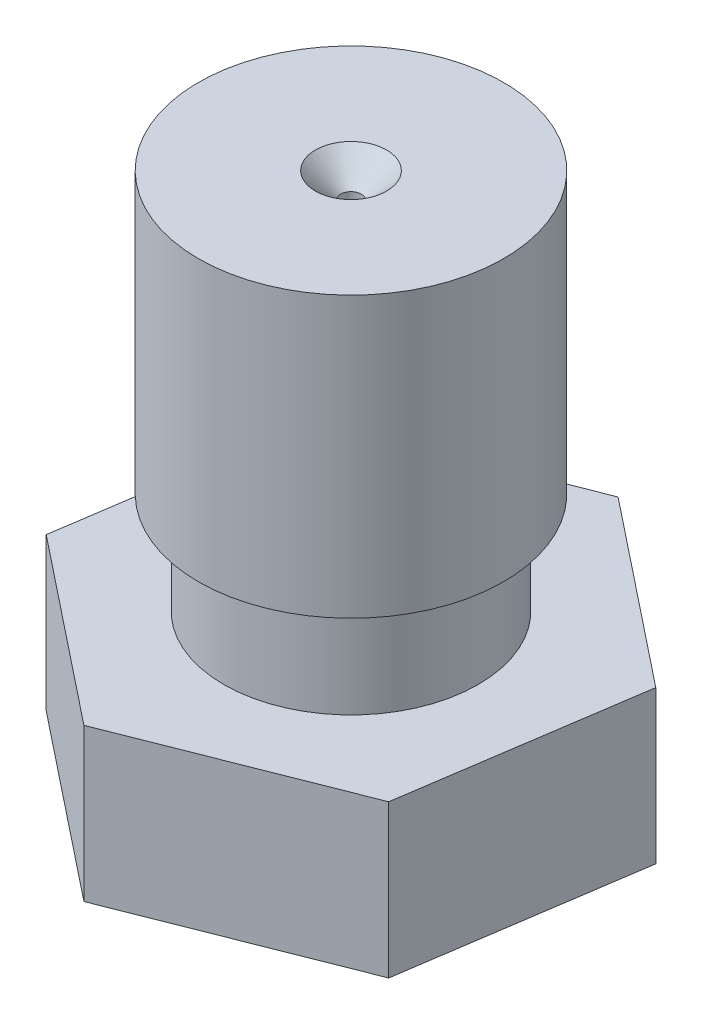
ISO-10303-21;
HEADER;
FILE_DESCRIPTION(('STEP AP214'),'2;1');
FILE_NAME('part.step','',(''),(''),'','','');
FILE_SCHEMA(('AUTOMOTIVE_DESIGN { 1 0 10303 214 1 1 1 1 }'));
ENDSEC;
DATA;
#1=APPLICATION_CONTEXT('core data for automotive mechanical design processes');
#2=APPLICATION_PROTOCOL_DEFINITION('international standard','automotive_design',2000,#1);
#3=PRODUCT_CONTEXT('',#1,'mechanical');
#4=PRODUCT('Part','Part','',(#3));
#5=PRODUCT_RELATED_PRODUCT_CATEGORY('part','',(#4));
#6=PRODUCT_DEFINITION_FORMATION('','',#4);
#7=PRODUCT_DEFINITION_CONTEXT('part definition',#1,'design');
#8=PRODUCT_DEFINITION('design','',#6,#7);
#9=PRODUCT_DEFINITION_SHAPE('','',#8);
#10=(LENGTH_UNIT() NAMED_UNIT(*) SI_UNIT(.MILLI.,.METRE.));
#11=(NAMED_UNIT(*) PLANE_ANGLE_UNIT() SI_UNIT($,.RADIAN.));
#12=(NAMED_UNIT(*) SI_UNIT($,.STERADIAN.) SOLID_ANGLE_UNIT());
#13=UNCERTAINTY_MEASURE_WITH_UNIT(LENGTH_MEASURE(1.E-05),#10,'distance_accuracy_value','');
#14=(GEOMETRIC_REPRESENTATION_CONTEXT(3) GLOBAL_UNCERTAINTY_ASSIGNED_CONTEXT((#13)) GLOBAL_UNIT_ASSIGNED_CONTEXT((#10,
#11,#12)) REPRESENTATION_CONTEXT('',''));
#15=CARTESIAN_POINT('',(0.,0.,0.));
#16=DIRECTION('',(0.,0.,1.));
#17=DIRECTION('',(1.,0.,0.));
#18=AXIS2_PLACEMENT_3D('',#15,#16,#17);
#19=CARTESIAN_POINT('',(0.,2.,0.));
#20=DIRECTION('',(0.,1.,0.));
#21=DIRECTION('',(0.,0.,1.));
#22=AXIS2_PLACEMENT_3D('',#19,#20,#21);
#23=PLANE('',#22);
#24=CARTESIAN_POINT('',(0.,2.,0.));
#25=DIRECTION('',(0.,1.,0.));
#26=DIRECTION('',(0.,0.,1.));
#27=AXIS2_PLACEMENT_3D('',#24,#25,#26);
#28=CIRCLE('',#27,2.00041507641941);
#29=CARTESIAN_POINT('',(0.,2.,2.00041507641941));
#30=VERTEX_POINT('',#29);
#31=EDGE_CURVE('E148',#30,#30,#28,.T.);
#32=ORIENTED_EDGE('',*,*,#31,.T.);
#33=EDGE_LOOP('',(#32));
#34=FACE_BOUND('',#33,.T.);
#35=DIRECTION('',(0.782739224767982,0.,0.622349826070209));
#36=VECTOR('',#35,1.);
#37=CARTESIAN_POINT('',(-2.48939930428083,2.,3.13095689907193));
#38=LINE('',#37,#36);
#39=CARTESIAN_POINT('',(-4.29705811278113,2.,1.69370154062492));
#40=VERTEX_POINT('',#39);
#41=CARTESIAN_POINT('',(-0.681740495780542,2.,4.56821225751893));
#42=VERTEX_POINT('',#41);
#43=EDGE_CURVE('E134',#40,#42,#38,.T.);
#44=ORIENTED_EDGE('',*,*,#43,.F.);
#45=DIRECTION('',(-0.147601147033637,0.,0.989046966222714));
#46=VECTOR('',#45,1.);
#47=CARTESIAN_POINT('',(-3.95618786489086,2.,-0.590404588134547));
#48=LINE('',#47,#46);
#49=CARTESIAN_POINT('',(-3.61531761700059,2.,-2.87451071689401));
#50=VERTEX_POINT('',#49);
#51=EDGE_CURVE('E132',#50,#40,#48,.T.);
#52=ORIENTED_EDGE('',*,*,#51,.F.);
#53=DIRECTION('',(-0.930340371801619,0.,0.366697140152505));
#54=VECTOR('',#53,1.);
#55=CARTESIAN_POINT('',(-1.46678856061002,2.,-3.72136148720647));
#56=LINE('',#55,#54);
#57=CARTESIAN_POINT('',(0.681740495780541,2.,-4.56821225751893));
#58=VERTEX_POINT('',#57);
#59=EDGE_CURVE('E130',#58,#50,#56,.T.);
#60=ORIENTED_EDGE('',*,*,#59,.F.);
#61=DIRECTION('',(-0.782739224767982,0.,-0.622349826070209));
#62=VECTOR('',#61,1.);
#63=CARTESIAN_POINT('',(2.48939930428083,2.,-3.13095689907193));
#64=LINE('',#63,#62);
#65=CARTESIAN_POINT('',(4.29705811278113,2.,-1.69370154062492));
#66=VERTEX_POINT('',#65);
#67=EDGE_CURVE('E128',#66,#58,#64,.T.);
#68=ORIENTED_EDGE('',*,*,#67,.F.);
#69=DIRECTION('',(0.147601147033637,0.,-0.989046966222714));
#70=VECTOR('',#69,1.);
#71=CARTESIAN_POINT('',(3.95618786489086,2.,0.590404588134546));
#72=LINE('',#71,#70);
#73=CARTESIAN_POINT('',(3.61531761700059,2.,2.87451071689401));
#74=VERTEX_POINT('',#73);
#75=EDGE_CURVE('E90',#74,#66,#72,.T.);
#76=ORIENTED_EDGE('',*,*,#75,.F.);
#77=DIRECTION('',(0.930340371801619,0.,-0.366697140152505));
#78=VECTOR('',#77,1.);
#79=CARTESIAN_POINT('',(1.46678856061002,2.,3.72136148720647));
#80=LINE('',#79,#78);
#81=EDGE_CURVE('E120',#42,#74,#80,.T.);
#82=ORIENTED_EDGE('',*,*,#81,.F.);
#83=EDGE_LOOP('',(#44,#52,#60,#68,#76,#82));
#84=FACE_BOUND('',#83,.T.);
#85=ADVANCED_FACE('F34',(#34,#84),#23,.F.);
#86=CARTESIAN_POINT('',(0.,5.,0.));
#87=DIRECTION('',(0.,-1.,0.));
#88=DIRECTION('',(0.,0.,-1.));
#89=AXIS2_PLACEMENT_3D('',#86,#87,#88);
#90=PLANE('',#89);
#91=CARTESIAN_POINT('',(0.,5.,0.));
#92=DIRECTION('',(0.,1.,0.));
#93=DIRECTION('',(0.,0.,1.));
#94=AXIS2_PLACEMENT_3D('',#91,#92,#93);
#95=CIRCLE('',#94,2.5);
#96=CARTESIAN_POINT('',(0.,5.,2.5));
#97=VERTEX_POINT('',#96);
#98=EDGE_CURVE('E145',#97,#97,#95,.T.);
#99=ORIENTED_EDGE('',*,*,#98,.F.);
#100=EDGE_LOOP('',(#99));
#101=FACE_BOUND('',#100,.T.);
#102=DIRECTION('',(0.782739224767982,0.,0.622349826070209));
#103=VECTOR('',#102,1.);
#104=CARTESIAN_POINT('',(-4.29705811278113,5.,1.69370154062492));
#105=LINE('',#104,#103);
#106=CARTESIAN_POINT('',(-4.29705811278113,5.,1.69370154062492));
#107=VERTEX_POINT('',#106);
#108=CARTESIAN_POINT('',(-0.681740495780542,5.,4.56821225751893));
#109=VERTEX_POINT('',#108);
#110=EDGE_CURVE('E110',#107,#109,#105,.T.);
#111=ORIENTED_EDGE('',*,*,#110,.T.);
#112=DIRECTION('',(0.930340371801619,0.,-0.366697140152505));
#113=VECTOR('',#112,1.);
#114=CARTESIAN_POINT('',(-0.681740495780542,5.,4.56821225751893));
#115=LINE('',#114,#113);
#116=CARTESIAN_POINT('',(3.61531761700059,5.,2.87451071689401));
#117=VERTEX_POINT('',#116);
#118=EDGE_CURVE('E108',#109,#117,#115,.T.);
#119=ORIENTED_EDGE('',*,*,#118,.T.);
#120=DIRECTION('',(0.147601147033637,0.,-0.989046966222714));
#121=VECTOR('',#120,1.);
#122=CARTESIAN_POINT('',(3.61531761700059,5.,2.87451071689401));
#123=LINE('',#122,#121);
#124=CARTESIAN_POINT('',(4.29705811278113,5.,-1.69370154062492));
#125=VERTEX_POINT('',#124);
#126=EDGE_CURVE('E57',#117,#125,#123,.T.);
#127=ORIENTED_EDGE('',*,*,#126,.T.);
#128=DIRECTION('',(-0.782739224767982,0.,-0.622349826070208));
#129=VECTOR('',#128,1.);
#130=CARTESIAN_POINT('',(4.29705811278113,5.,-1.69370154062492));
#131=LINE('',#130,#129);
#132=CARTESIAN_POINT('',(0.681740495780541,5.,-4.56821225751893));
#133=VERTEX_POINT('',#132);
#134=EDGE_CURVE('E97',#125,#133,#131,.T.);
#135=ORIENTED_EDGE('',*,*,#134,.T.);
#136=DIRECTION('',(-0.930340371801619,0.,0.366697140152505));
#137=VECTOR('',#136,1.);
#138=CARTESIAN_POINT('',(0.681740495780541,5.,-4.56821225751893));
#139=LINE('',#138,#137);
#140=CARTESIAN_POINT('',(-3.61531761700059,5.,-2.87451071689401));
#141=VERTEX_POINT('',#140);
#142=EDGE_CURVE('E103',#133,#141,#139,.T.);
#143=ORIENTED_EDGE('',*,*,#142,.T.);
#144=DIRECTION('',(-0.147601147033637,0.,0.989046966222714));
#145=VECTOR('',#144,1.);
#146=CARTESIAN_POINT('',(-3.61531761700059,5.,-2.87451071689401));
#147=LINE('',#146,#145);
#148=EDGE_CURVE('E115',#141,#107,#147,.T.);
#149=ORIENTED_EDGE('',*,*,#148,.T.);
#150=EDGE_LOOP('',(#111,#119,#127,#135,#143,#149));
#151=FACE_BOUND('',#150,.T.);
#152=ADVANCED_FACE('F107',(#101,#151),#90,.F.);
#153=CARTESIAN_POINT('',(0.,12.5,0.));
#154=DIRECTION('',(0.,1.,0.));
#155=DIRECTION('',(0.,0.,1.));
#156=AXIS2_PLACEMENT_3D('',#153,#154,#155);
#157=PLANE('',#156);
#158=CARTESIAN_POINT('',(0.,12.5,0.));
#159=DIRECTION('',(0.,1.,0.));
#160=DIRECTION('',(0.,0.,1.));
#161=AXIS2_PLACEMENT_3D('',#158,#159,#160);
#162=CIRCLE('',#161,0.699999999999994);
#163=CARTESIAN_POINT('',(0.,12.5,0.699999999999993));
#164=VERTEX_POINT('',#163);
#165=EDGE_CURVE('E11',#164,#164,#162,.F.);
#166=ORIENTED_EDGE('',*,*,#165,.T.);
#167=EDGE_LOOP('',(#166));
#168=FACE_BOUND('',#167,.T.);
#169=CARTESIAN_POINT('',(0.,12.5,0.));
#170=DIRECTION('',(0.,1.,0.));
#171=DIRECTION('',(0.,0.,1.));
#172=AXIS2_PLACEMENT_3D('',#169,#170,#171);
#173=CIRCLE('',#172,3.);
#174=CARTESIAN_POINT('',(0.,12.5,3.));
#175=VERTEX_POINT('',#174);
#176=EDGE_CURVE('E136',#175,#175,#173,.T.);
#177=ORIENTED_EDGE('',*,*,#176,.T.);
#178=EDGE_LOOP('',(#177));
#179=FACE_BOUND('',#178,.T.);
#180=ADVANCED_FACE('F183',(#168,#179),#157,.T.);
#181=CARTESIAN_POINT('',(0.,12.5,0.));
#182=DIRECTION('',(0.,1.,0.));
#183=DIRECTION('',(0.,0.,1.));
#184=AXIS2_PLACEMENT_3D('',#181,#182,#183);
#185=CYLINDRICAL_SURFACE('',#184,0.199999999999999);
#186=CARTESIAN_POINT('',(0.,12.,0.));
#187=DIRECTION('',(0.,1.,0.));
#188=DIRECTION('',(0.,0.,1.));
#189=AXIS2_PLACEMENT_3D('',#186,#187,#188);
#190=CIRCLE('',#189,0.199999999999999);
#191=CARTESIAN_POINT('',(0.,12.,0.199999999999998));
#192=VERTEX_POINT('',#191);
#193=EDGE_CURVE('E42',#192,#192,#190,.T.);
#194=ORIENTED_EDGE('',*,*,#193,.T.);
#195=EDGE_LOOP('',(#194));
#196=FACE_BOUND('',#195,.T.);
#197=CARTESIAN_POINT('',(0.,0.,0.));
#198=DIRECTION('',(0.,1.,0.));
#199=DIRECTION('',(0.,0.,1.));
#200=AXIS2_PLACEMENT_3D('',#197,#198,#199);
#201=CIRCLE('',#200,0.2);
#202=CARTESIAN_POINT('',(0.,0.,0.2));
#203=VERTEX_POINT('',#202);
#204=EDGE_CURVE('E154',#203,#203,#201,.T.);
#205=ORIENTED_EDGE('',*,*,#204,.F.);
#206=EDGE_LOOP('',(#205));
#207=FACE_BOUND('',#206,.T.);
#208=ADVANCED_FACE('F159',(#196,#207),#185,.F.);
#209=CARTESIAN_POINT('',(0.,0.,0.));
#210=DIRECTION('',(0.,1.,0.));
#211=DIRECTION('',(0.,0.,1.));
#212=AXIS2_PLACEMENT_3D('',#209,#210,#211);
#213=PLANE('',#212);
#214=CARTESIAN_POINT('',(0.,0.,0.));
#215=DIRECTION('',(0.,1.,0.));
#216=DIRECTION('',(0.,0.,1.));
#217=AXIS2_PLACEMENT_3D('',#214,#215,#216);
#218=CIRCLE('',#217,0.6);
#219=CARTESIAN_POINT('',(0.,0.,0.6));
#220=VERTEX_POINT('',#219);
#221=EDGE_CURVE('E151',#220,#220,#218,.T.);
#222=ORIENTED_EDGE('',*,*,#221,.F.);
#223=EDGE_LOOP('',(#222));
#224=FACE_BOUND('',#223,.T.);
#225=ORIENTED_EDGE('',*,*,#204,.T.);
#226=EDGE_LOOP('',(#225));
#227=FACE_BOUND('',#226,.T.);
#228=ADVANCED_FACE('F193',(#224,#227),#213,.F.);
#229=CARTESIAN_POINT('',(0.,0.,0.));
#230=DIRECTION('',(0.,1.,0.));
#231=DIRECTION('',(0.,0.,1.));
#232=AXIS2_PLACEMENT_3D('',#229,#230,#231);
#233=CONICAL_SURFACE('',#232,0.6,0.610865238198013);
#234=CARTESIAN_POINT('',(0.,2.,2.00041507641941));
#235=CARTESIAN_POINT('',(0.,1.97916666666667,1.98582741937338));
#236=CARTESIAN_POINT('',(0.,1.95833333333333,1.97123976232734));
#237=CARTESIAN_POINT('',(0.,1.91666666666667,1.94206444823527));
#238=CARTESIAN_POINT('',(0.,1.89583333333333,1.92747679118923));
#239=CARTESIAN_POINT('',(0.,1.85416666666667,1.89830147709716));
#240=CARTESIAN_POINT('',(0.,1.83333333333333,1.88371382005113));
#241=CARTESIAN_POINT('',(0.,1.79166666666667,1.85453850595906));
#242=CARTESIAN_POINT('',(0.,1.77083333333333,1.83995084891302));
#243=CARTESIAN_POINT('',(0.,1.72916666666667,1.81077553482095));
#244=CARTESIAN_POINT('',(0.,1.70833333333333,1.79618787777491));
#245=CARTESIAN_POINT('',(0.,1.66666666666667,1.76701256368284));
#246=CARTESIAN_POINT('',(0.,1.64583333333333,1.75242490663681));
#247=CARTESIAN_POINT('',(0.,1.60416666666667,1.72324959254474));
#248=CARTESIAN_POINT('',(0.,1.58333333333333,1.7086619354987));
#249=CARTESIAN_POINT('',(0.,1.54166666666667,1.67948662140663));
#250=CARTESIAN_POINT('',(0.,1.52083333333333,1.66489896436059));
#251=CARTESIAN_POINT('',(0.,1.47916666666667,1.63572365026852));
#252=CARTESIAN_POINT('',(0.,1.45833333333333,1.62113599322249));
#253=CARTESIAN_POINT('',(0.,1.41666666666667,1.59196067913042));
#254=CARTESIAN_POINT('',(0.,1.39583333333333,1.57737302208438));
#255=CARTESIAN_POINT('',(0.,1.35416666666667,1.54819770799231));
#256=CARTESIAN_POINT('',(0.,1.33333333333333,1.53361005094627));
#257=CARTESIAN_POINT('',(0.,1.29166666666667,1.5044347368542));
#258=CARTESIAN_POINT('',(0.,1.27083333333333,1.48984707980817));
#259=CARTESIAN_POINT('',(0.,1.22916666666667,1.4606717657161));
#260=CARTESIAN_POINT('',(0.,1.20833333333333,1.44608410867006));
#261=CARTESIAN_POINT('',(0.,1.16666666666667,1.41690879457799));
#262=CARTESIAN_POINT('',(0.,1.14583333333333,1.40232113753195));
#263=CARTESIAN_POINT('',(0.,1.10416666666667,1.37314582343988));
#264=CARTESIAN_POINT('',(0.,1.08333333333333,1.35855816639385));
#265=CARTESIAN_POINT('',(0.,1.04166666666667,1.32938285230178));
#266=CARTESIAN_POINT('',(0.,1.02083333333333,1.31479519525574));
#267=CARTESIAN_POINT('',(0.,0.979166666666667,1.28561988116367));
#268=CARTESIAN_POINT('',(0.,0.958333333333333,1.27103222411763));
#269=CARTESIAN_POINT('',(0.,0.916666666666667,1.24185691002556));
#270=CARTESIAN_POINT('',(0.,0.895833333333333,1.22726925297953));
#271=CARTESIAN_POINT('',(0.,0.854166666666667,1.19809393888746));
#272=CARTESIAN_POINT('',(0.,0.833333333333333,1.18350628184142));
#273=CARTESIAN_POINT('',(0.,0.791666666666667,1.15433096774935));
#274=CARTESIAN_POINT('',(0.,0.770833333333333,1.13974331070332));
#275=CARTESIAN_POINT('',(0.,0.729166666666667,1.11056799661124));
#276=CARTESIAN_POINT('',(0.,0.708333333333333,1.09598033956521));
#277=CARTESIAN_POINT('',(0.,0.666666666666667,1.06680502547314));
#278=CARTESIAN_POINT('',(0.,0.645833333333333,1.0522173684271));
#279=CARTESIAN_POINT('',(0.,0.604166666666667,1.02304205433503));
#280=CARTESIAN_POINT('',(0.,0.583333333333333,1.00845439728899));
#281=CARTESIAN_POINT('',(0.,0.541666666666667,0.979279083196924));
#282=CARTESIAN_POINT('',(0.,0.520833333333333,0.964691426150889));
#283=CARTESIAN_POINT('',(0.,0.479166666666667,0.935516112058817));
#284=CARTESIAN_POINT('',(0.,0.458333333333333,0.920928455012782));
#285=CARTESIAN_POINT('',(0.,0.416666666666667,0.891753140920711));
#286=CARTESIAN_POINT('',(0.,0.395833333333333,0.877165483874675));
#287=CARTESIAN_POINT('',(0.,0.354166666666667,0.847990169782604));
#288=CARTESIAN_POINT('',(0.,0.333333333333333,0.833402512736569));
#289=CARTESIAN_POINT('',(0.,0.291666666666667,0.804227198644498));
#290=CARTESIAN_POINT('',(0.,0.270833333333333,0.789639541598462));
#291=CARTESIAN_POINT('',(0.,0.229166666666667,0.760464227506391));
#292=CARTESIAN_POINT('',(0.,0.208333333333333,0.745876570460355));
#293=CARTESIAN_POINT('',(0.,0.166666666666667,0.716701256368284));
#294=CARTESIAN_POINT('',(0.,0.145833333333333,0.702113599322249));
#295=CARTESIAN_POINT('',(0.,0.104166666666667,0.672938285230178));
#296=CARTESIAN_POINT('',(0.,0.0833333333333334,0.658350628184142));
#297=CARTESIAN_POINT('',(0.,0.0416666666666667,0.629175314092071));
#298=CARTESIAN_POINT('',(0.,0.0208333333333333,0.614587657046035));
#299=CARTESIAN_POINT('',(0.,0.,0.6));
#300=B_SPLINE_CURVE_WITH_KNOTS('',3,(#234,#235,#236,#237,#238,#239,#240,#241,#242,#243,#244,
#245,#246,#247,#248,#249,#250,#251,#252,#253,#254,#255,#256,#257,#258,#259,#260,#261,#262,#263,
#264,#265,#266,#267,#268,#269,#270,#271,#272,#273,#274,#275,#276,#277,#278,#279,#280,#281,#282,
#283,#284,#285,#286,#287,#288,#289,#290,#291,#292,#293,#294,#295,#296,#297,#298,#299),
.UNSPECIFIED.,.F.,.F.,(4,2,2,2,2,2,2,2,2,2,2,2,2,2,2,2,2,2,2,2,2,2,2,2,2,2,2,2,2,2,2,2,4),(0.,
0.076298411797591,0.152596823595182,0.228895235392772,0.305193647190363,0.381492058987954,
0.457790470785545,0.534088882583136,0.610387294380727,0.686685706178318,0.762984117975909,
0.839282529773499,0.91558094157109,0.991879353368681,1.06817776516627,1.14447617696386,
1.22077458876145,1.29707300055905,1.37337141235664,1.44966982415423,1.52596823595182,
1.60226664774941,1.678565059547,1.75486347134459,1.83116188314218,1.90746029493977,
1.98375870673736,2.06005711853495,2.13635553033254,2.21265394213014,2.28895235392773,
2.36525076572532,2.44154917752291),.UNSPECIFIED.);
#301=EDGE_CURVE('BSEAM189',#30,#220,#300,.T.);
#302=ORIENTED_EDGE('',*,*,#31,.F.);
#303=ORIENTED_EDGE('',*,*,#221,.T.);
#304=ORIENTED_EDGE('',*,*,#301,.T.);
#305=ORIENTED_EDGE('',*,*,#301,.F.);
#306=EDGE_LOOP('',(#302,#304,#303,#305));
#307=FACE_BOUND('',#306,.T.);
#308=ADVANCED_FACE('F189',(#307),#233,.T.);
#309=CARTESIAN_POINT('',(0.,12.5,0.));
#310=DIRECTION('',(0.,1.,0.));
#311=DIRECTION('',(0.,0.,1.));
#312=AXIS2_PLACEMENT_3D('',#309,#310,#311);
#313=CYLINDRICAL_SURFACE('',#312,2.5);
#314=CARTESIAN_POINT('',(0.,7.,0.));
#315=DIRECTION('',(0.,1.,0.));
#316=DIRECTION('',(0.,0.,1.));
#317=AXIS2_PLACEMENT_3D('',#314,#315,#316);
#318=CIRCLE('',#317,2.5);
#319=CARTESIAN_POINT('',(0.,7.,2.5));
#320=VERTEX_POINT('',#319);
#321=EDGE_CURVE('E142',#320,#320,#318,.T.);
#322=ORIENTED_EDGE('',*,*,#321,.F.);
#323=EDGE_LOOP('',(#322));
#324=FACE_BOUND('',#323,.T.);
#325=ORIENTED_EDGE('',*,*,#98,.T.);
#326=EDGE_LOOP('',(#325));
#327=FACE_BOUND('',#326,.T.);
#328=ADVANCED_FACE('F192',(#324,#327),#313,.T.);
#329=CARTESIAN_POINT('',(0.,7.,0.));
#330=DIRECTION('',(0.,1.,0.));
#331=DIRECTION('',(0.,0.,1.));
#332=AXIS2_PLACEMENT_3D('',#329,#330,#331);
#333=PLANE('',#332);
#334=CARTESIAN_POINT('',(0.,7.,0.));
#335=DIRECTION('',(0.,1.,0.));
#336=DIRECTION('',(0.,0.,1.));
#337=AXIS2_PLACEMENT_3D('',#334,#335,#336);
#338=CIRCLE('',#337,3.);
#339=CARTESIAN_POINT('',(0.,7.,3.));
#340=VERTEX_POINT('',#339);
#341=EDGE_CURVE('E139',#340,#340,#338,.T.);
#342=ORIENTED_EDGE('',*,*,#341,.F.);
#343=EDGE_LOOP('',(#342));
#344=FACE_BOUND('',#343,.T.);
#345=ORIENTED_EDGE('',*,*,#321,.T.);
#346=EDGE_LOOP('',(#345));
#347=FACE_BOUND('',#346,.T.);
#348=ADVANCED_FACE('F173',(#344,#347),#333,.F.);
#349=CARTESIAN_POINT('',(0.,12.5,0.));
#350=DIRECTION('',(0.,1.,0.));
#351=DIRECTION('',(0.,0.,1.));
#352=AXIS2_PLACEMENT_3D('',#349,#350,#351);
#353=CYLINDRICAL_SURFACE('',#352,3.);
#354=ORIENTED_EDGE('',*,*,#176,.F.);
#355=EDGE_LOOP('',(#354));
#356=FACE_BOUND('',#355,.T.);
#357=ORIENTED_EDGE('',*,*,#341,.T.);
#358=EDGE_LOOP('',(#357));
#359=FACE_BOUND('',#358,.T.);
#360=ADVANCED_FACE('F164',(#356,#359),#353,.T.);
#361=CARTESIAN_POINT('',(0.,12.,0.));
#362=DIRECTION('',(0.,1.,0.));
#363=DIRECTION('',(0.,0.,1.));
#364=AXIS2_PLACEMENT_3D('',#361,#362,#363);
#365=CONICAL_SURFACE('',#364,0.199999999999999,0.78539816339745);
#366=CARTESIAN_POINT('',(0.,12.5,0.699999999999993));
#367=CARTESIAN_POINT('',(0.,12.4947916666667,0.69479166666666));
#368=CARTESIAN_POINT('',(0.,12.4895833333333,0.689583333333326));
#369=CARTESIAN_POINT('',(0.,12.4791666666667,0.67916666666666));
#370=CARTESIAN_POINT('',(0.,12.4739583333333,0.673958333333327));
#371=CARTESIAN_POINT('',(0.,12.4635416666667,0.66354166666666));
#372=CARTESIAN_POINT('',(0.,12.4583333333333,0.658333333333327));
#373=CARTESIAN_POINT('',(0.,12.4479166666667,0.64791666666666));
#374=CARTESIAN_POINT('',(0.,12.4427083333333,0.642708333333327));
#375=CARTESIAN_POINT('',(0.,12.4322916666667,0.632291666666661));
#376=CARTESIAN_POINT('',(0.,12.4270833333333,0.627083333333327));
#377=CARTESIAN_POINT('',(0.,12.4166666666667,0.616666666666661));
#378=CARTESIAN_POINT('',(0.,12.4114583333333,0.611458333333327));
#379=CARTESIAN_POINT('',(0.,12.4010416666667,0.601041666666661));
#380=CARTESIAN_POINT('',(0.,12.3958333333333,0.595833333333328));
#381=CARTESIAN_POINT('',(0.,12.3854166666667,0.585416666666661));
#382=CARTESIAN_POINT('',(0.,12.3802083333333,0.580208333333328));
#383=CARTESIAN_POINT('',(0.,12.3697916666667,0.569791666666661));
#384=CARTESIAN_POINT('',(0.,12.3645833333333,0.564583333333328));
#385=CARTESIAN_POINT('',(0.,12.3541666666667,0.554166666666661));
#386=CARTESIAN_POINT('',(0.,12.3489583333333,0.548958333333328));
#387=CARTESIAN_POINT('',(0.,12.3385416666667,0.538541666666661));
#388=CARTESIAN_POINT('',(0.,12.3333333333333,0.533333333333328));
#389=CARTESIAN_POINT('',(0.,12.3229166666667,0.522916666666662));
#390=CARTESIAN_POINT('',(0.,12.3177083333333,0.517708333333328));
#391=CARTESIAN_POINT('',(0.,12.3072916666667,0.507291666666662));
#392=CARTESIAN_POINT('',(0.,12.3020833333333,0.502083333333328));
#393=CARTESIAN_POINT('',(0.,12.2916666666667,0.491666666666662));
#394=CARTESIAN_POINT('',(0.,12.2864583333333,0.486458333333329));
#395=CARTESIAN_POINT('',(0.,12.2760416666667,0.476041666666662));
#396=CARTESIAN_POINT('',(0.,12.2708333333333,0.470833333333329));
#397=CARTESIAN_POINT('',(0.,12.2604166666667,0.460416666666662));
#398=CARTESIAN_POINT('',(0.,12.2552083333333,0.455208333333329));
#399=CARTESIAN_POINT('',(0.,12.2447916666667,0.444791666666662));
#400=CARTESIAN_POINT('',(0.,12.2395833333333,0.439583333333329));
#401=CARTESIAN_POINT('',(0.,12.2291666666667,0.429166666666662));
#402=CARTESIAN_POINT('',(0.,12.2239583333333,0.423958333333329));
#403=CARTESIAN_POINT('',(0.,12.2135416666667,0.413541666666663));
#404=CARTESIAN_POINT('',(0.,12.2083333333333,0.408333333333329));
#405=CARTESIAN_POINT('',(0.,12.1979166666667,0.397916666666663));
#406=CARTESIAN_POINT('',(0.,12.1927083333333,0.392708333333329));
#407=CARTESIAN_POINT('',(0.,12.1822916666667,0.382291666666663));
#408=CARTESIAN_POINT('',(0.,12.1770833333333,0.37708333333333));
#409=CARTESIAN_POINT('',(0.,12.1666666666667,0.366666666666663));
#410=CARTESIAN_POINT('',(0.,12.1614583333333,0.36145833333333));
#411=CARTESIAN_POINT('',(0.,12.1510416666667,0.351041666666663));
#412=CARTESIAN_POINT('',(0.,12.1458333333333,0.34583333333333));
#413=CARTESIAN_POINT('',(0.,12.1354166666667,0.335416666666663));
#414=CARTESIAN_POINT('',(0.,12.1302083333333,0.33020833333333));
#415=CARTESIAN_POINT('',(0.,12.1197916666667,0.319791666666663));
#416=CARTESIAN_POINT('',(0.,12.1145833333333,0.31458333333333));
#417=CARTESIAN_POINT('',(0.,12.1041666666667,0.304166666666664));
#418=CARTESIAN_POINT('',(0.,12.0989583333333,0.29895833333333));
#419=CARTESIAN_POINT('',(0.,12.0885416666667,0.288541666666664));
#420=CARTESIAN_POINT('',(0.,12.0833333333333,0.283333333333331));
#421=CARTESIAN_POINT('',(0.,12.0729166666667,0.272916666666664));
#422=CARTESIAN_POINT('',(0.,12.0677083333333,0.267708333333331));
#423=CARTESIAN_POINT('',(0.,12.0572916666667,0.257291666666664));
#424=CARTESIAN_POINT('',(0.,12.0520833333333,0.252083333333331));
#425=CARTESIAN_POINT('',(0.,12.0416666666667,0.241666666666664));
#426=CARTESIAN_POINT('',(0.,12.0364583333333,0.236458333333331));
#427=CARTESIAN_POINT('',(0.,12.0260416666667,0.226041666666664));
#428=CARTESIAN_POINT('',(0.,12.0208333333333,0.220833333333331));
#429=CARTESIAN_POINT('',(0.,12.0104166666667,0.210416666666665));
#430=CARTESIAN_POINT('',(0.,12.0052083333333,0.205208333333331));
#431=CARTESIAN_POINT('',(0.,12.,0.199999999999998));
#432=B_SPLINE_CURVE_WITH_KNOTS('',3,(#366,#367,#368,#369,#370,#371,#372,#373,#374,#375,#376,
#377,#378,#379,#380,#381,#382,#383,#384,#385,#386,#387,#388,#389,#390,#391,#392,#393,#394,#395,
#396,#397,#398,#399,#400,#401,#402,#403,#404,#405,#406,#407,#408,#409,#410,#411,#412,#413,#414,
#415,#416,#417,#418,#419,#420,#421,#422,#423,#424,#425,#426,#427,#428,#429,#430,#431),
.UNSPECIFIED.,.F.,.F.,(4,2,2,2,2,2,2,2,2,2,2,2,2,2,2,2,2,2,2,2,2,2,2,2,2,2,2,2,2,2,2,2,4),(0.,
0.0220970869120783,0.0441941738241577,0.0662912607362372,0.0883883476483168,0.110485434560396,
0.132582521472476,0.154679608384555,0.176776695296634,0.198873782208713,0.220970869120793,
0.243067956032872,0.265165042944952,0.287262129857031,0.309359216769111,0.33145630368119,
0.35355339059327,0.375650477505348,0.397747564417428,0.419844651329507,0.441941738241587,
0.464038825153666,0.486135912065746,0.508232998977825,0.530330085889903,0.552427172801983,
0.574524259714063,0.596621346626142,0.618718433538222,0.640815520450301,0.662912607362381,
0.68500969427446,0.70710678118654),.UNSPECIFIED.);
#433=EDGE_CURVE('BSEAM36',#164,#192,#432,.T.);
#434=ORIENTED_EDGE('',*,*,#165,.F.);
#435=ORIENTED_EDGE('',*,*,#193,.F.);
#436=ORIENTED_EDGE('',*,*,#433,.T.);
#437=ORIENTED_EDGE('',*,*,#433,.F.);
#438=EDGE_LOOP('',(#434,#436,#435,#437));
#439=FACE_BOUND('',#438,.T.);
#440=ADVANCED_FACE('F36',(#439),#365,.F.);
#441=CARTESIAN_POINT('',(-4.29705811278113,-5.,1.69370154062492));
#442=DIRECTION('',(-0.622349826070209,0.,0.782739224767982));
#443=DIRECTION('',(0.782739224767982,0.,0.622349826070209));
#444=AXIS2_PLACEMENT_3D('',#441,#442,#443);
#445=PLANE('',#444);
#446=ORIENTED_EDGE('',*,*,#43,.T.);
#447=DIRECTION('',(0.,1.,0.));
#448=VECTOR('',#447,1.);
#449=CARTESIAN_POINT('',(-0.681740495780542,-5.,4.56821225751893));
#450=LINE('',#449,#448);
#451=EDGE_CURVE('E49',#42,#109,#450,.T.);
#452=ORIENTED_EDGE('',*,*,#451,.T.);
#453=ORIENTED_EDGE('',*,*,#110,.F.);
#454=DIRECTION('',(0.,1.,0.));
#455=VECTOR('',#454,1.);
#456=CARTESIAN_POINT('',(-4.29705811278113,-5.,1.69370154062492));
#457=LINE('',#456,#455);
#458=EDGE_CURVE('E118',#40,#107,#457,.T.);
#459=ORIENTED_EDGE('',*,*,#458,.F.);
#460=EDGE_LOOP('',(#446,#452,#453,#459));
#461=FACE_BOUND('',#460,.T.);
#462=ADVANCED_FACE('F163',(#461),#445,.T.);
#463=CARTESIAN_POINT('',(-3.61531761700059,-5.,-2.87451071689401));
#464=DIRECTION('',(-0.989046966222714,0.,-0.147601147033637));
#465=DIRECTION('',(-0.147601147033637,0.,0.989046966222714));
#466=AXIS2_PLACEMENT_3D('',#463,#464,#465);
#467=PLANE('',#466);
#468=ORIENTED_EDGE('',*,*,#51,.T.);
#469=ORIENTED_EDGE('',*,*,#458,.T.);
#470=ORIENTED_EDGE('',*,*,#148,.F.);
#471=DIRECTION('',(0.,1.,0.));
#472=VECTOR('',#471,1.);
#473=CARTESIAN_POINT('',(-3.61531761700059,-5.,-2.87451071689401));
#474=LINE('',#473,#472);
#475=EDGE_CURVE('E121',#50,#141,#474,.T.);
#476=ORIENTED_EDGE('',*,*,#475,.F.);
#477=EDGE_LOOP('',(#468,#469,#470,#476));
#478=FACE_BOUND('',#477,.T.);
#479=ADVANCED_FACE('F170',(#478),#467,.T.);
#480=CARTESIAN_POINT('',(0.681740495780541,-5.,-4.56821225751893));
#481=DIRECTION('',(-0.366697140152505,0.,-0.930340371801619));
#482=DIRECTION('',(-0.930340371801619,0.,0.366697140152505));
#483=AXIS2_PLACEMENT_3D('',#480,#481,#482);
#484=PLANE('',#483);
#485=ORIENTED_EDGE('',*,*,#59,.T.);
#486=ORIENTED_EDGE('',*,*,#475,.T.);
#487=ORIENTED_EDGE('',*,*,#142,.F.);
#488=DIRECTION('',(0.,1.,0.));
#489=VECTOR('',#488,1.);
#490=CARTESIAN_POINT('',(0.681740495780541,-5.,-4.56821225751893));
#491=LINE('',#490,#489);
#492=EDGE_CURVE('E93',#58,#133,#491,.T.);
#493=ORIENTED_EDGE('',*,*,#492,.F.);
#494=EDGE_LOOP('',(#485,#486,#487,#493));
#495=FACE_BOUND('',#494,.T.);
#496=ADVANCED_FACE('F226',(#495),#484,.T.);
#497=CARTESIAN_POINT('',(4.29705811278113,-5.,-1.69370154062492));
#498=DIRECTION('',(0.622349826070208,0.,-0.782739224767982));
#499=DIRECTION('',(-0.782739224767982,0.,-0.622349826070209));
#500=AXIS2_PLACEMENT_3D('',#497,#498,#499);
#501=PLANE('',#500);
#502=ORIENTED_EDGE('',*,*,#67,.T.);
#503=ORIENTED_EDGE('',*,*,#492,.T.);
#504=ORIENTED_EDGE('',*,*,#134,.F.);
#505=DIRECTION('',(0.,1.,0.));
#506=VECTOR('',#505,1.);
#507=CARTESIAN_POINT('',(4.29705811278113,-5.,-1.69370154062492));
#508=LINE('',#507,#506);
#509=EDGE_CURVE('E86',#66,#125,#508,.T.);
#510=ORIENTED_EDGE('',*,*,#509,.F.);
#511=EDGE_LOOP('',(#502,#503,#504,#510));
#512=FACE_BOUND('',#511,.T.);
#513=ADVANCED_FACE('F98',(#512),#501,.T.);
#514=CARTESIAN_POINT('',(3.61531761700059,-5.,2.87451071689401));
#515=DIRECTION('',(0.989046966222714,0.,0.147601147033637));
#516=DIRECTION('',(0.147601147033637,0.,-0.989046966222714));
#517=AXIS2_PLACEMENT_3D('',#514,#515,#516);
#518=PLANE('',#517);
#519=ORIENTED_EDGE('',*,*,#75,.T.);
#520=ORIENTED_EDGE('',*,*,#509,.T.);
#521=ORIENTED_EDGE('',*,*,#126,.F.);
#522=DIRECTION('',(0.,1.,0.));
#523=VECTOR('',#522,1.);
#524=CARTESIAN_POINT('',(3.61531761700059,-5.,2.87451071689401));
#525=LINE('',#524,#523);
#526=EDGE_CURVE('E94',#74,#117,#525,.T.);
#527=ORIENTED_EDGE('',*,*,#526,.F.);
#528=EDGE_LOOP('',(#519,#520,#521,#527));
#529=FACE_BOUND('',#528,.T.);
#530=ADVANCED_FACE('F88',(#529),#518,.T.);
#531=CARTESIAN_POINT('',(-0.681740495780542,-5.,4.56821225751893));
#532=DIRECTION('',(0.366697140152505,0.,0.930340371801619));
#533=DIRECTION('',(0.930340371801619,0.,-0.366697140152505));
#534=AXIS2_PLACEMENT_3D('',#531,#532,#533);
#535=PLANE('',#534);
#536=ORIENTED_EDGE('',*,*,#81,.T.);
#537=ORIENTED_EDGE('',*,*,#526,.T.);
#538=ORIENTED_EDGE('',*,*,#118,.F.);
#539=ORIENTED_EDGE('',*,*,#451,.F.);
#540=EDGE_LOOP('',(#536,#537,#538,#539));
#541=FACE_BOUND('',#540,.T.);
#542=ADVANCED_FACE('F219',(#541),#535,.T.);
#543=CLOSED_SHELL('',(#85,#152,#180,#208,#228,#308,#328,#348,#360,#440,#462,#479,#496,#513,#530,#542));
#544=MANIFOLD_SOLID_BREP('B2',#543);
#545=ADVANCED_BREP_SHAPE_REPRESENTATION('',(#18,#544),#14);
#546=SHAPE_DEFINITION_REPRESENTATION(#9,#545);
ENDSEC;
END-ISO-10303-21;
